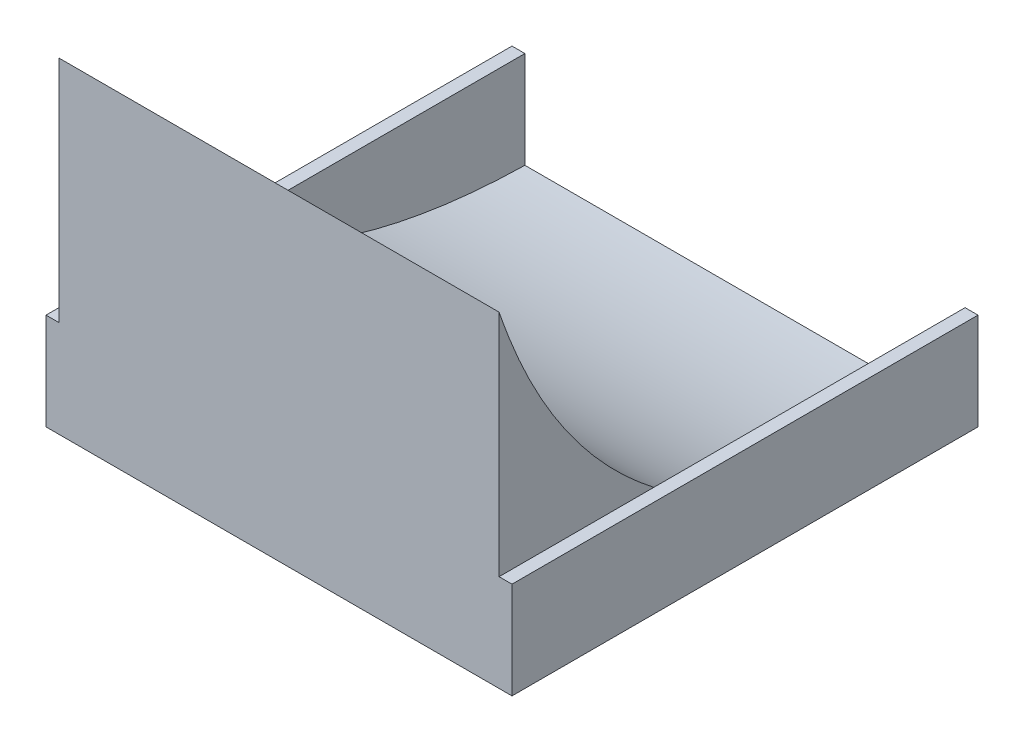
ISO-10303-21;
HEADER;
FILE_DESCRIPTION(('STEP AP214'),'2;1');
FILE_NAME('part.step','',(''),(''),'','','');
FILE_SCHEMA(('AUTOMOTIVE_DESIGN { 1 0 10303 214 1 1 1 1 }'));
ENDSEC;
DATA;
#1=APPLICATION_CONTEXT('core data for automotive mechanical design processes');
#2=APPLICATION_PROTOCOL_DEFINITION('international standard','automotive_design',2000,#1);
#3=PRODUCT_CONTEXT('',#1,'mechanical');
#4=PRODUCT('Part','Part','',(#3));
#5=PRODUCT_RELATED_PRODUCT_CATEGORY('part','',(#4));
#6=PRODUCT_DEFINITION_FORMATION('','',#4);
#7=PRODUCT_DEFINITION_CONTEXT('part definition',#1,'design');
#8=PRODUCT_DEFINITION('design','',#6,#7);
#9=PRODUCT_DEFINITION_SHAPE('','',#8);
#10=(LENGTH_UNIT() NAMED_UNIT(*) SI_UNIT(.MILLI.,.METRE.));
#11=(NAMED_UNIT(*) PLANE_ANGLE_UNIT() SI_UNIT($,.RADIAN.));
#12=(NAMED_UNIT(*) SI_UNIT($,.STERADIAN.) SOLID_ANGLE_UNIT());
#13=UNCERTAINTY_MEASURE_WITH_UNIT(LENGTH_MEASURE(1.E-05),#10,'distance_accuracy_value','');
#14=(GEOMETRIC_REPRESENTATION_CONTEXT(3) GLOBAL_UNCERTAINTY_ASSIGNED_CONTEXT((#13)) GLOBAL_UNIT_ASSIGNED_CONTEXT((#10,
#11,#12)) REPRESENTATION_CONTEXT('',''));
#15=CARTESIAN_POINT('',(0.,0.,0.));
#16=DIRECTION('',(0.,0.,1.));
#17=DIRECTION('',(1.,0.,0.));
#18=AXIS2_PLACEMENT_3D('',#15,#16,#17);
#19=CARTESIAN_POINT('',(68.2,13.1970761798394,-26.4246562596004));
#20=DIRECTION('',(-1.,0.,0.));
#21=DIRECTION('',(0.,0.,1.));
#22=AXIS2_PLACEMENT_3D('',#19,#20,#21);
#23=PLANE('',#22);
#24=DIRECTION('',(0.,0.,1.));
#25=VECTOR('',#24,1.);
#26=CARTESIAN_POINT('',(68.2,15.,0.));
#27=LINE('',#26,#25);
#28=CARTESIAN_POINT('',(68.2,14.9999999961049,-23.9755713456914));
#29=VERTEX_POINT('',#28);
#30=CARTESIAN_POINT('',(68.2,15.,0.));
#31=VERTEX_POINT('',#30);
#32=EDGE_CURVE('E11',#29,#31,#27,.T.);
#33=ORIENTED_EDGE('',*,*,#32,.F.);
#34=CARTESIAN_POINT('',(68.2,0.,-72.2));
#35=CARTESIAN_POINT('',(68.2,1.14415235967881,-16.7493125192009));
#36=CARTESIAN_POINT('',(68.2,50.5,0.));
#37=B_SPLINE_CURVE_WITH_KNOTS('',2,(#34,#35,#36),.UNSPECIFIED.,.F.,.F.,(3,3),(0.,1.),.UNSPECIFIED.);
#38=CARTESIAN_POINT('',(68.2,50.5,0.));
#39=VERTEX_POINT('',#38);
#40=EDGE_CURVE('E200',#29,#39,#37,.T.);
#41=ORIENTED_EDGE('',*,*,#40,.T.);
#42=DIRECTION('',(0.,-1.,0.));
#43=VECTOR('',#42,1.);
#44=CARTESIAN_POINT('',(68.2,50.5,0.));
#45=LINE('',#44,#43);
#46=EDGE_CURVE('E197',#39,#31,#45,.T.);
#47=ORIENTED_EDGE('',*,*,#46,.T.);
#48=EDGE_LOOP('',(#33,#41,#47));
#49=FACE_BOUND('',#48,.T.);
#50=ADVANCED_FACE('F45',(#49),#23,.F.);
#51=CARTESIAN_POINT('',(68.2,50.5,0.));
#52=DIRECTION('',(0.,0.,-1.));
#53=DIRECTION('',(0.,1.,0.));
#54=AXIS2_PLACEMENT_3D('',#51,#52,#53);
#55=PLANE('',#54);
#56=DIRECTION('',(0.,-1.,0.));
#57=VECTOR('',#56,1.);
#58=CARTESIAN_POINT('',(0.,50.5,0.));
#59=LINE('',#58,#57);
#60=CARTESIAN_POINT('',(0.,50.5,0.));
#61=VERTEX_POINT('',#60);
#62=CARTESIAN_POINT('',(0.,15.,0.));
#63=VERTEX_POINT('',#62);
#64=EDGE_CURVE('E196',#61,#63,#59,.T.);
#65=ORIENTED_EDGE('',*,*,#64,.T.);
#66=DIRECTION('',(1.,0.,0.));
#67=VECTOR('',#66,1.);
#68=CARTESIAN_POINT('',(-2.,15.,0.));
#69=LINE('',#68,#67);
#70=CARTESIAN_POINT('',(-2.,15.,0.));
#71=VERTEX_POINT('',#70);
#72=EDGE_CURVE('E192',#71,#63,#69,.T.);
#73=ORIENTED_EDGE('',*,*,#72,.F.);
#74=DIRECTION('',(0.,1.,0.));
#75=VECTOR('',#74,1.);
#76=CARTESIAN_POINT('',(-2.,0.,0.));
#77=LINE('',#76,#75);
#78=CARTESIAN_POINT('',(-2.,0.,0.));
#79=VERTEX_POINT('',#78);
#80=EDGE_CURVE('E125',#79,#71,#77,.T.);
#81=ORIENTED_EDGE('',*,*,#80,.F.);
#82=DIRECTION('',(-1.,0.,0.));
#83=VECTOR('',#82,1.);
#84=CARTESIAN_POINT('',(68.2,0.,0.));
#85=LINE('',#84,#83);
#86=CARTESIAN_POINT('',(70.2,0.,0.));
#87=VERTEX_POINT('',#86);
#88=EDGE_CURVE('E49',#87,#79,#85,.T.);
#89=ORIENTED_EDGE('',*,*,#88,.F.);
#90=DIRECTION('',(0.,-1.,0.));
#91=VECTOR('',#90,1.);
#92=CARTESIAN_POINT('',(70.2,0.,0.));
#93=LINE('',#92,#91);
#94=CARTESIAN_POINT('',(70.2,15.,0.));
#95=VERTEX_POINT('',#94);
#96=EDGE_CURVE('E122',#95,#87,#93,.T.);
#97=ORIENTED_EDGE('',*,*,#96,.F.);
#98=DIRECTION('',(-1.,0.,0.));
#99=VECTOR('',#98,1.);
#100=CARTESIAN_POINT('',(70.2,15.,0.));
#101=LINE('',#100,#99);
#102=EDGE_CURVE('E155',#95,#31,#101,.T.);
#103=ORIENTED_EDGE('',*,*,#102,.T.);
#104=ORIENTED_EDGE('',*,*,#46,.F.);
#105=DIRECTION('',(-1.,0.,0.));
#106=VECTOR('',#105,1.);
#107=CARTESIAN_POINT('',(68.2,50.5,0.));
#108=LINE('',#107,#106);
#109=EDGE_CURVE('E209',#39,#61,#108,.T.);
#110=ORIENTED_EDGE('',*,*,#109,.T.);
#111=EDGE_LOOP('',(#65,#73,#81,#89,#97,#103,#104,#110));
#112=FACE_BOUND('',#111,.T.);
#113=ADVANCED_FACE('F47',(#112),#55,.F.);
#114=CARTESIAN_POINT('',(68.2,0.,0.));
#115=DIRECTION('',(0.,1.,0.));
#116=DIRECTION('',(0.,0.,1.));
#117=AXIS2_PLACEMENT_3D('',#114,#115,#116);
#118=PLANE('',#117);
#119=ORIENTED_EDGE('',*,*,#88,.T.);
#120=DIRECTION('',(0.,0.,1.));
#121=VECTOR('',#120,1.);
#122=CARTESIAN_POINT('',(-2.,0.,0.));
#123=LINE('',#122,#121);
#124=CARTESIAN_POINT('',(-2.,0.,-72.2));
#125=VERTEX_POINT('',#124);
#126=EDGE_CURVE('E176',#125,#79,#123,.T.);
#127=ORIENTED_EDGE('',*,*,#126,.F.);
#128=DIRECTION('',(1.,0.,0.));
#129=VECTOR('',#128,1.);
#130=CARTESIAN_POINT('',(-2.,0.,-72.2));
#131=LINE('',#130,#129);
#132=CARTESIAN_POINT('',(0.,0.,-72.2));
#133=VERTEX_POINT('',#132);
#134=EDGE_CURVE('E179',#125,#133,#131,.T.);
#135=ORIENTED_EDGE('',*,*,#134,.T.);
#136=DIRECTION('',(-1.,0.,0.));
#137=VECTOR('',#136,1.);
#138=CARTESIAN_POINT('',(68.2,0.,-72.2));
#139=LINE('',#138,#137);
#140=CARTESIAN_POINT('',(68.2,0.,-72.2));
#141=VERTEX_POINT('',#140);
#142=EDGE_CURVE('E130',#141,#133,#139,.T.);
#143=ORIENTED_EDGE('',*,*,#142,.F.);
#144=DIRECTION('',(-1.,0.,0.));
#145=VECTOR('',#144,1.);
#146=CARTESIAN_POINT('',(70.2,0.,-72.2));
#147=LINE('',#146,#145);
#148=CARTESIAN_POINT('',(70.2,0.,-72.2));
#149=VERTEX_POINT('',#148);
#150=EDGE_CURVE('E135',#149,#141,#147,.T.);
#151=ORIENTED_EDGE('',*,*,#150,.F.);
#152=DIRECTION('',(0.,0.,-1.));
#153=VECTOR('',#152,1.);
#154=CARTESIAN_POINT('',(70.2,0.,0.));
#155=LINE('',#154,#153);
#156=EDGE_CURVE('E132',#87,#149,#155,.T.);
#157=ORIENTED_EDGE('',*,*,#156,.F.);
#158=EDGE_LOOP('',(#119,#127,#135,#143,#151,#157));
#159=FACE_BOUND('',#158,.T.);
#160=ADVANCED_FACE('F133',(#159),#118,.F.);
#161=DIRECTION('',(-1.,0.,0.));
#162=VECTOR('',#161,1.);
#163=SURFACE_OF_LINEAR_EXTRUSION('',#37,#162);
#164=CARTESIAN_POINT('',(0.,0.,-72.2));
#165=CARTESIAN_POINT('',(0.,1.14415235967881,-16.7493125192009));
#166=CARTESIAN_POINT('',(0.,50.5,0.));
#167=B_SPLINE_CURVE_WITH_KNOTS('',2,(#164,#165,#166),.UNSPECIFIED.,.F.,.F.,(3,3),(0.,1.),.UNSPECIFIED.);
#168=CARTESIAN_POINT('',(0.,15.,-23.9755713456914));
#169=VERTEX_POINT('',#168);
#170=EDGE_CURVE('E201',#133,#169,#167,.T.);
#171=ORIENTED_EDGE('',*,*,#170,.T.);
#172=EDGE_CURVE('E353',#169,#61,#167,.T.);
#173=ORIENTED_EDGE('',*,*,#172,.T.);
#174=ORIENTED_EDGE('',*,*,#109,.F.);
#175=ORIENTED_EDGE('',*,*,#40,.F.);
#176=EDGE_CURVE('E202',#141,#29,#37,.T.);
#177=ORIENTED_EDGE('',*,*,#176,.F.);
#178=ORIENTED_EDGE('',*,*,#142,.T.);
#179=EDGE_LOOP('',(#171,#173,#174,#175,#177,#178));
#180=FACE_BOUND('',#179,.T.);
#181=ADVANCED_FACE('F215',(#180),#163,.F.);
#182=CARTESIAN_POINT('',(0.,13.1970761798394,-26.4246562596004));
#183=DIRECTION('',(-1.,0.,0.));
#184=DIRECTION('',(0.,0.,1.));
#185=AXIS2_PLACEMENT_3D('',#182,#183,#184);
#186=PLANE('',#185);
#187=DIRECTION('',(0.,0.,-1.));
#188=VECTOR('',#187,1.);
#189=CARTESIAN_POINT('',(0.,15.,0.));
#190=LINE('',#189,#188);
#191=EDGE_CURVE('E69',#63,#169,#190,.T.);
#192=ORIENTED_EDGE('',*,*,#191,.F.);
#193=ORIENTED_EDGE('',*,*,#64,.F.);
#194=ORIENTED_EDGE('',*,*,#172,.F.);
#195=EDGE_LOOP('',(#192,#193,#194));
#196=FACE_BOUND('',#195,.T.);
#197=ADVANCED_FACE('F218',(#196),#186,.T.);
#198=CARTESIAN_POINT('',(-2.,15.,0.));
#199=DIRECTION('',(0.,-1.,0.));
#200=DIRECTION('',(0.,0.,-1.));
#201=AXIS2_PLACEMENT_3D('',#198,#199,#200);
#202=PLANE('',#201);
#203=ORIENTED_EDGE('',*,*,#191,.T.);
#204=CARTESIAN_POINT('',(0.,15.,-72.2));
#205=VERTEX_POINT('',#204);
#206=EDGE_CURVE('E166',#169,#205,#190,.T.);
#207=ORIENTED_EDGE('',*,*,#206,.T.);
#208=DIRECTION('',(1.,0.,0.));
#209=VECTOR('',#208,1.);
#210=CARTESIAN_POINT('',(-2.,15.,-72.2));
#211=LINE('',#210,#209);
#212=CARTESIAN_POINT('',(-2.,15.,-72.2));
#213=VERTEX_POINT('',#212);
#214=EDGE_CURVE('E188',#213,#205,#211,.T.);
#215=ORIENTED_EDGE('',*,*,#214,.F.);
#216=DIRECTION('',(0.,0.,-1.));
#217=VECTOR('',#216,1.);
#218=CARTESIAN_POINT('',(-2.,15.,0.));
#219=LINE('',#218,#217);
#220=EDGE_CURVE('E169',#71,#213,#219,.T.);
#221=ORIENTED_EDGE('',*,*,#220,.F.);
#222=ORIENTED_EDGE('',*,*,#72,.T.);
#223=EDGE_LOOP('',(#203,#207,#215,#221,#222));
#224=FACE_BOUND('',#223,.T.);
#225=ADVANCED_FACE('F230',(#224),#202,.F.);
#226=CARTESIAN_POINT('',(-2.,0.,-72.2));
#227=DIRECTION('',(0.,0.,1.));
#228=DIRECTION('',(1.,0.,0.));
#229=AXIS2_PLACEMENT_3D('',#226,#227,#228);
#230=PLANE('',#229);
#231=DIRECTION('',(0.,-1.,0.));
#232=VECTOR('',#231,1.);
#233=CARTESIAN_POINT('',(0.,0.,-72.2));
#234=LINE('',#233,#232);
#235=EDGE_CURVE('E170',#205,#133,#234,.T.);
#236=ORIENTED_EDGE('',*,*,#235,.T.);
#237=ORIENTED_EDGE('',*,*,#134,.F.);
#238=DIRECTION('',(0.,-1.,0.));
#239=VECTOR('',#238,1.);
#240=CARTESIAN_POINT('',(-2.,0.,-72.2));
#241=LINE('',#240,#239);
#242=EDGE_CURVE('E173',#213,#125,#241,.T.);
#243=ORIENTED_EDGE('',*,*,#242,.F.);
#244=ORIENTED_EDGE('',*,*,#214,.T.);
#245=EDGE_LOOP('',(#236,#237,#243,#244));
#246=FACE_BOUND('',#245,.T.);
#247=ADVANCED_FACE('F233',(#246),#230,.F.);
#248=CARTESIAN_POINT('',(-2.,0.,0.));
#249=DIRECTION('',(-1.,0.,0.));
#250=DIRECTION('',(0.,0.,1.));
#251=AXIS2_PLACEMENT_3D('',#248,#249,#250);
#252=PLANE('',#251);
#253=ORIENTED_EDGE('',*,*,#80,.T.);
#254=ORIENTED_EDGE('',*,*,#220,.T.);
#255=ORIENTED_EDGE('',*,*,#242,.T.);
#256=ORIENTED_EDGE('',*,*,#126,.T.);
#257=EDGE_LOOP('',(#253,#254,#255,#256));
#258=FACE_BOUND('',#257,.T.);
#259=ADVANCED_FACE('F237',(#258),#252,.T.);
#260=CARTESIAN_POINT('',(0.,0.,0.));
#261=DIRECTION('',(-1.,0.,0.));
#262=DIRECTION('',(0.,0.,1.));
#263=AXIS2_PLACEMENT_3D('',#260,#261,#262);
#264=PLANE('',#263);
#265=ORIENTED_EDGE('',*,*,#170,.F.);
#266=ORIENTED_EDGE('',*,*,#235,.F.);
#267=ORIENTED_EDGE('',*,*,#206,.F.);
#268=EDGE_LOOP('',(#265,#266,#267));
#269=FACE_BOUND('',#268,.T.);
#270=ADVANCED_FACE('F239',(#269),#264,.F.);
#271=CARTESIAN_POINT('',(70.2,0.,-72.2));
#272=DIRECTION('',(0.,0.,1.));
#273=DIRECTION('',(1.,0.,0.));
#274=AXIS2_PLACEMENT_3D('',#271,#272,#273);
#275=PLANE('',#274);
#276=DIRECTION('',(0.,1.,0.));
#277=VECTOR('',#276,1.);
#278=CARTESIAN_POINT('',(68.2,0.,-72.2));
#279=LINE('',#278,#277);
#280=CARTESIAN_POINT('',(68.2,15.,-72.2));
#281=VERTEX_POINT('',#280);
#282=EDGE_CURVE('E149',#141,#281,#279,.T.);
#283=ORIENTED_EDGE('',*,*,#282,.T.);
#284=DIRECTION('',(-1.,0.,0.));
#285=VECTOR('',#284,1.);
#286=CARTESIAN_POINT('',(70.2,15.,-72.2));
#287=LINE('',#286,#285);
#288=CARTESIAN_POINT('',(70.2,15.,-72.2));
#289=VERTEX_POINT('',#288);
#290=EDGE_CURVE('E160',#289,#281,#287,.T.);
#291=ORIENTED_EDGE('',*,*,#290,.F.);
#292=DIRECTION('',(0.,1.,0.));
#293=VECTOR('',#292,1.);
#294=CARTESIAN_POINT('',(70.2,0.,-72.2));
#295=LINE('',#294,#293);
#296=EDGE_CURVE('E139',#149,#289,#295,.T.);
#297=ORIENTED_EDGE('',*,*,#296,.F.);
#298=ORIENTED_EDGE('',*,*,#150,.T.);
#299=EDGE_LOOP('',(#283,#291,#297,#298));
#300=FACE_BOUND('',#299,.T.);
#301=ADVANCED_FACE('F241',(#300),#275,.F.);
#302=CARTESIAN_POINT('',(70.2,15.,0.));
#303=DIRECTION('',(0.,-1.,0.));
#304=DIRECTION('',(0.,0.,-1.));
#305=AXIS2_PLACEMENT_3D('',#302,#303,#304);
#306=PLANE('',#305);
#307=EDGE_CURVE('E56',#281,#29,#27,.T.);
#308=ORIENTED_EDGE('',*,*,#307,.T.);
#309=ORIENTED_EDGE('',*,*,#32,.T.);
#310=ORIENTED_EDGE('',*,*,#102,.F.);
#311=DIRECTION('',(0.,0.,1.));
#312=VECTOR('',#311,1.);
#313=CARTESIAN_POINT('',(70.2,15.,0.));
#314=LINE('',#313,#312);
#315=EDGE_CURVE('E143',#289,#95,#314,.T.);
#316=ORIENTED_EDGE('',*,*,#315,.F.);
#317=ORIENTED_EDGE('',*,*,#290,.T.);
#318=EDGE_LOOP('',(#308,#309,#310,#316,#317));
#319=FACE_BOUND('',#318,.T.);
#320=ADVANCED_FACE('F248',(#319),#306,.F.);
#321=CARTESIAN_POINT('',(70.2,0.,0.));
#322=DIRECTION('',(-1.,0.,0.));
#323=DIRECTION('',(0.,0.,1.));
#324=AXIS2_PLACEMENT_3D('',#321,#322,#323);
#325=PLANE('',#324);
#326=ORIENTED_EDGE('',*,*,#96,.T.);
#327=ORIENTED_EDGE('',*,*,#156,.T.);
#328=ORIENTED_EDGE('',*,*,#296,.T.);
#329=ORIENTED_EDGE('',*,*,#315,.T.);
#330=EDGE_LOOP('',(#326,#327,#328,#329));
#331=FACE_BOUND('',#330,.T.);
#332=ADVANCED_FACE('F141',(#331),#325,.F.);
#333=CARTESIAN_POINT('',(68.2,0.,0.));
#334=DIRECTION('',(-1.,0.,0.));
#335=DIRECTION('',(0.,0.,1.));
#336=AXIS2_PLACEMENT_3D('',#333,#334,#335);
#337=PLANE('',#336);
#338=ORIENTED_EDGE('',*,*,#282,.F.);
#339=ORIENTED_EDGE('',*,*,#176,.T.);
#340=ORIENTED_EDGE('',*,*,#307,.F.);
#341=EDGE_LOOP('',(#338,#339,#340));
#342=FACE_BOUND('',#341,.T.);
#343=ADVANCED_FACE('F253',(#342),#337,.T.);
#344=CLOSED_SHELL('',(#50,#113,#160,#181,#197,#225,#247,#259,#270,#301,#320,#332,#343));
#345=MANIFOLD_SOLID_BREP('B2',#344);
#346=ADVANCED_BREP_SHAPE_REPRESENTATION('',(#18,#345),#14);
#347=SHAPE_DEFINITION_REPRESENTATION(#9,#346);
ENDSEC;
END-ISO-10303-21;
